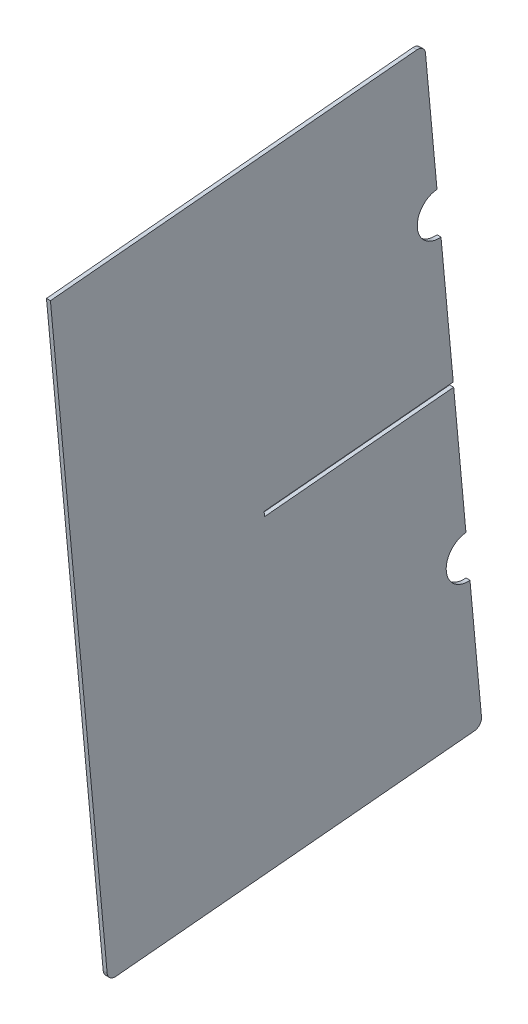
ISO-10303-21;
HEADER;
FILE_DESCRIPTION(('STEP AP214'),'2;1');
FILE_NAME('part.step','',(''),(''),'','','');
FILE_SCHEMA(('AUTOMOTIVE_DESIGN { 1 0 10303 214 1 1 1 1 }'));
ENDSEC;
DATA;
#1=APPLICATION_CONTEXT('core data for automotive mechanical design processes');
#2=APPLICATION_PROTOCOL_DEFINITION('international standard','automotive_design',2000,#1);
#3=PRODUCT_CONTEXT('',#1,'mechanical');
#4=PRODUCT('Part','Part','',(#3));
#5=PRODUCT_RELATED_PRODUCT_CATEGORY('part','',(#4));
#6=PRODUCT_DEFINITION_FORMATION('','',#4);
#7=PRODUCT_DEFINITION_CONTEXT('part definition',#1,'design');
#8=PRODUCT_DEFINITION('design','',#6,#7);
#9=PRODUCT_DEFINITION_SHAPE('','',#8);
#10=(LENGTH_UNIT() NAMED_UNIT(*) SI_UNIT(.MILLI.,.METRE.));
#11=(NAMED_UNIT(*) PLANE_ANGLE_UNIT() SI_UNIT($,.RADIAN.));
#12=(NAMED_UNIT(*) SI_UNIT($,.STERADIAN.) SOLID_ANGLE_UNIT());
#13=UNCERTAINTY_MEASURE_WITH_UNIT(LENGTH_MEASURE(1.E-05),#10,'distance_accuracy_value','');
#14=(GEOMETRIC_REPRESENTATION_CONTEXT(3) GLOBAL_UNCERTAINTY_ASSIGNED_CONTEXT((#13)) GLOBAL_UNIT_ASSIGNED_CONTEXT((#10,
#11,#12)) REPRESENTATION_CONTEXT('',''));
#15=CARTESIAN_POINT('',(0.,0.,0.));
#16=DIRECTION('',(0.,0.,1.));
#17=DIRECTION('',(1.,0.,0.));
#18=AXIS2_PLACEMENT_3D('',#15,#16,#17);
#19=CARTESIAN_POINT('',(-60.4999999998031,-99.708493786069,804.821228277155));
#20=DIRECTION('',(0.,-0.99571264607084,-0.092500413267217));
#21=DIRECTION('',(0.,0.092500413267217,-0.99571264607084));
#22=AXIS2_PLACEMENT_3D('',#19,#20,#21);
#23=PLANE('',#22);
#24=DIRECTION('',(0.,-0.092500413267217,0.99571264607084));
#25=VECTOR('',#24,1.);
#26=CARTESIAN_POINT('',(-61.4999999998031,-99.708493786069,804.821228277155));
#27=LINE('',#26,#25);
#28=CARTESIAN_POINT('',(-61.4999999998031,-99.8934946126034,806.812653569297));
#29=VERTEX_POINT('',#28);
#30=CARTESIAN_POINT('',(-61.4999999998031,-108.31103221992,897.422504361746));
#31=VERTEX_POINT('',#30);
#32=EDGE_CURVE('E156',#29,#31,#27,.T.);
#33=ORIENTED_EDGE('',*,*,#32,.F.);
#34=DIRECTION('',(-1.,0.,0.));
#35=VECTOR('',#34,1.);
#36=CARTESIAN_POINT('',(-60.4999999998031,-99.8934946126034,806.812653569297));
#37=LINE('',#36,#35);
#38=CARTESIAN_POINT('',(-60.4999999998031,-99.8934946126034,806.812653569297));
#39=VERTEX_POINT('',#38);
#40=EDGE_CURVE('E46',#29,#39,#37,.F.);
#41=ORIENTED_EDGE('',*,*,#40,.T.);
#42=DIRECTION('',(0.,-0.092500413267217,0.99571264607084));
#43=VECTOR('',#42,1.);
#44=CARTESIAN_POINT('',(-60.4999999998031,-99.708493786069,804.821228277155));
#45=LINE('',#44,#43);
#46=CARTESIAN_POINT('',(-60.4999999998032,-108.31103221992,897.422504361746));
#47=VERTEX_POINT('',#46);
#48=EDGE_CURVE('E164',#39,#47,#45,.T.);
#49=ORIENTED_EDGE('',*,*,#48,.T.);
#50=DIRECTION('',(1.,0.,0.));
#51=VECTOR('',#50,1.);
#52=CARTESIAN_POINT('',(-60.4999999998032,-108.31103221992,897.422504361746));
#53=LINE('',#52,#51);
#54=EDGE_CURVE('E257',#47,#31,#53,.F.);
#55=ORIENTED_EDGE('',*,*,#54,.T.);
#56=EDGE_LOOP('',(#33,#41,#49,#55));
#57=FACE_BOUND('',#56,.T.);
#58=ADVANCED_FACE('F38',(#57),#23,.T.);
#59=CARTESIAN_POINT('',(-60.4999999998029,-66.3521201426958,807.919992121607));
#60=DIRECTION('',(0.,0.0925004132672192,-0.99571264607084));
#61=DIRECTION('',(0.,0.99571264607084,0.0925004132672192));
#62=AXIS2_PLACEMENT_3D('',#59,#60,#61);
#63=PLANE('',#62);
#64=DIRECTION('',(0.,-0.99571264607084,-0.0925004132672192));
#65=VECTOR('',#64,1.);
#66=CARTESIAN_POINT('',(-60.4999999998029,-66.3521201426958,807.919992121607));
#67=LINE('',#66,#65);
#68=CARTESIAN_POINT('',(-60.4999999998029,-66.3521201426958,807.919992121607));
#69=VERTEX_POINT('',#68);
#70=CARTESIAN_POINT('',(-60.4999999998031,-97.7170684939274,805.00622910369));
#71=VERTEX_POINT('',#70);
#72=EDGE_CURVE('E198',#69,#71,#67,.T.);
#73=ORIENTED_EDGE('',*,*,#72,.T.);
#74=DIRECTION('',(-1.,0.,0.));
#75=VECTOR('',#74,1.);
#76=CARTESIAN_POINT('',(-60.4999999998031,-97.7170684939274,805.00622910369));
#77=LINE('',#76,#75);
#78=CARTESIAN_POINT('',(-61.4999999998031,-97.7170684939274,805.00622910369));
#79=VERTEX_POINT('',#78);
#80=EDGE_CURVE('E262',#71,#79,#77,.T.);
#81=ORIENTED_EDGE('',*,*,#80,.T.);
#82=DIRECTION('',(0.,-0.99571264607084,-0.0925004132672192));
#83=VECTOR('',#82,1.);
#84=CARTESIAN_POINT('',(-61.4999999998029,-66.3521201426958,807.919992121607));
#85=LINE('',#84,#83);
#86=CARTESIAN_POINT('',(-61.4999999998029,-66.3521201426958,807.919992121607));
#87=VERTEX_POINT('',#86);
#88=EDGE_CURVE('E232',#87,#79,#85,.T.);
#89=ORIENTED_EDGE('',*,*,#88,.F.);
#90=DIRECTION('',(-1.,0.,0.));
#91=VECTOR('',#90,1.);
#92=CARTESIAN_POINT('',(-60.4999999998029,-66.3521201426958,807.919992121607));
#93=LINE('',#92,#91);
#94=EDGE_CURVE('E235',#69,#87,#93,.T.);
#95=ORIENTED_EDGE('',*,*,#94,.F.);
#96=EDGE_LOOP('',(#73,#81,#89,#95));
#97=FACE_BOUND('',#96,.T.);
#98=ADVANCED_FACE('F268',(#97),#63,.T.);
#99=CARTESIAN_POINT('',(-60.4999999998029,-60.8757005893063,808.428744394577));
#100=DIRECTION('',(-1.,0.,0.));
#101=DIRECTION('',(0.,-1.,0.));
#102=AXIS2_PLACEMENT_3D('',#99,#100,#101);
#103=CYLINDRICAL_SURFACE('',#102,5.49999999999996);
#104=CARTESIAN_POINT('',(-61.4999999998029,-60.8757005893063,808.428744394577));
#105=DIRECTION('',(1.,0.,0.));
#106=DIRECTION('',(0.,1.,0.));
#107=AXIS2_PLACEMENT_3D('',#104,#105,#106);
#108=CIRCLE('',#107,5.49999999999996);
#109=CARTESIAN_POINT('',(-61.4999999998028,-55.3992810359167,808.937496667546));
#110=VERTEX_POINT('',#109);
#111=EDGE_CURVE('E229',#110,#87,#108,.T.);
#112=ORIENTED_EDGE('',*,*,#111,.F.);
#113=DIRECTION('',(-1.,0.,0.));
#114=VECTOR('',#113,1.);
#115=CARTESIAN_POINT('',(-60.4999999998029,-55.3992810359167,808.937496667546));
#116=LINE('',#115,#114);
#117=CARTESIAN_POINT('',(-60.4999999998029,-55.3992810359167,808.937496667546));
#118=VERTEX_POINT('',#117);
#119=EDGE_CURVE('E237',#118,#110,#116,.T.);
#120=ORIENTED_EDGE('',*,*,#119,.F.);
#121=CARTESIAN_POINT('',(-60.4999999998029,-60.8757005893063,808.428744394577));
#122=DIRECTION('',(1.,0.,0.));
#123=DIRECTION('',(0.,1.,0.));
#124=AXIS2_PLACEMENT_3D('',#121,#122,#123);
#125=CIRCLE('',#124,5.49999999999996);
#126=EDGE_CURVE('E195',#118,#69,#125,.T.);
#127=ORIENTED_EDGE('',*,*,#126,.T.);
#128=ORIENTED_EDGE('',*,*,#94,.T.);
#129=EDGE_LOOP('',(#112,#120,#127,#128));
#130=FACE_BOUND('',#129,.T.);
#131=ADVANCED_FACE('F276',(#130),#103,.F.);
#132=CARTESIAN_POINT('',(-60.4999999998027,-22.0429073925434,812.036260511998));
#133=DIRECTION('',(0.,0.092500413267219,-0.99571264607084));
#134=DIRECTION('',(0.,0.99571264607084,0.092500413267219));
#135=AXIS2_PLACEMENT_3D('',#132,#133,#134);
#136=PLANE('',#135);
#137=DIRECTION('',(0.,-0.99571264607084,-0.092500413267219));
#138=VECTOR('',#137,1.);
#139=CARTESIAN_POINT('',(-61.4999999998027,-22.0429073925434,812.036260511998));
#140=LINE('',#139,#138);
#141=CARTESIAN_POINT('',(-61.4999999998027,-22.0429073925434,812.036260511998));
#142=VERTEX_POINT('',#141);
#143=EDGE_CURVE('E226',#142,#110,#140,.T.);
#144=ORIENTED_EDGE('',*,*,#143,.F.);
#145=DIRECTION('',(-1.,0.,0.));
#146=VECTOR('',#145,1.);
#147=CARTESIAN_POINT('',(-60.4999999998027,-22.0429073925434,812.036260511998));
#148=LINE('',#147,#146);
#149=CARTESIAN_POINT('',(-60.4999999998027,-22.0429073925434,812.036260511998));
#150=VERTEX_POINT('',#149);
#151=EDGE_CURVE('E239',#150,#142,#148,.T.);
#152=ORIENTED_EDGE('',*,*,#151,.F.);
#153=DIRECTION('',(0.,-0.99571264607084,-0.092500413267219));
#154=VECTOR('',#153,1.);
#155=CARTESIAN_POINT('',(-60.4999999998027,-22.0429073925434,812.036260511998));
#156=LINE('',#155,#154);
#157=EDGE_CURVE('E192',#150,#118,#156,.T.);
#158=ORIENTED_EDGE('',*,*,#157,.T.);
#159=ORIENTED_EDGE('',*,*,#119,.T.);
#160=EDGE_LOOP('',(#144,#152,#158,#159));
#161=FACE_BOUND('',#160,.T.);
#162=ADVANCED_FACE('F296',(#161),#136,.T.);
#163=CARTESIAN_POINT('',(-60.4999999998027,-26.4829272293701,859.830467523402));
#164=DIRECTION('',(0.,0.99571264607084,0.0925004132672169));
#165=DIRECTION('',(0.,-0.0925004132672169,0.99571264607084));
#166=AXIS2_PLACEMENT_3D('',#163,#164,#165);
#167=PLANE('',#166);
#168=DIRECTION('',(0.,0.0925004132672169,-0.99571264607084));
#169=VECTOR('',#168,1.);
#170=CARTESIAN_POINT('',(-61.4999999998027,-26.4829272293701,859.830467523402));
#171=LINE('',#170,#169);
#172=CARTESIAN_POINT('',(-61.4999999998027,-26.4829272293701,859.830467523402));
#173=VERTEX_POINT('',#172);
#174=EDGE_CURVE('E223',#173,#142,#171,.T.);
#175=ORIENTED_EDGE('',*,*,#174,.F.);
#176=DIRECTION('',(-1.,0.,0.));
#177=VECTOR('',#176,1.);
#178=CARTESIAN_POINT('',(-60.4999999998027,-26.4829272293701,859.830467523402));
#179=LINE('',#178,#177);
#180=CARTESIAN_POINT('',(-60.4999999998027,-26.4829272293701,859.830467523402));
#181=VERTEX_POINT('',#180);
#182=EDGE_CURVE('E241',#181,#173,#179,.T.);
#183=ORIENTED_EDGE('',*,*,#182,.F.);
#184=DIRECTION('',(0.,0.0925004132672169,-0.99571264607084));
#185=VECTOR('',#184,1.);
#186=CARTESIAN_POINT('',(-60.4999999998027,-26.4829272293701,859.830467523402));
#187=LINE('',#186,#185);
#188=EDGE_CURVE('E189',#181,#150,#187,.T.);
#189=ORIENTED_EDGE('',*,*,#188,.T.);
#190=ORIENTED_EDGE('',*,*,#151,.T.);
#191=EDGE_LOOP('',(#175,#183,#189,#190));
#192=FACE_BOUND('',#191,.T.);
#193=ADVANCED_FACE('F299',(#192),#167,.T.);
#194=CARTESIAN_POINT('',(-60.4999999998027,-25.2880720540852,859.941468019322));
#195=DIRECTION('',(0.,0.0925004132671777,-0.995712646070844));
#196=DIRECTION('',(0.,0.995712646070844,0.0925004132671777));
#197=AXIS2_PLACEMENT_3D('',#194,#195,#196);
#198=PLANE('',#197);
#199=DIRECTION('',(0.,-0.995712646070844,-0.0925004132671777));
#200=VECTOR('',#199,1.);
#201=CARTESIAN_POINT('',(-61.4999999998027,-25.2880720540852,859.941468019322));
#202=LINE('',#201,#200);
#203=CARTESIAN_POINT('',(-61.4999999998027,-25.2880720540852,859.941468019322));
#204=VERTEX_POINT('',#203);
#205=EDGE_CURVE('E220',#204,#173,#202,.T.);
#206=ORIENTED_EDGE('',*,*,#205,.F.);
#207=DIRECTION('',(-1.,0.,0.));
#208=VECTOR('',#207,1.);
#209=CARTESIAN_POINT('',(-60.4999999998027,-25.2880720540852,859.941468019322));
#210=LINE('',#209,#208);
#211=CARTESIAN_POINT('',(-60.4999999998027,-25.2880720540852,859.941468019322));
#212=VERTEX_POINT('',#211);
#213=EDGE_CURVE('E243',#212,#204,#210,.T.);
#214=ORIENTED_EDGE('',*,*,#213,.F.);
#215=DIRECTION('',(0.,-0.995712646070844,-0.0925004132671777));
#216=VECTOR('',#215,1.);
#217=CARTESIAN_POINT('',(-60.4999999998027,-25.2880720540852,859.941468019322));
#218=LINE('',#217,#216);
#219=EDGE_CURVE('E186',#212,#181,#218,.T.);
#220=ORIENTED_EDGE('',*,*,#219,.T.);
#221=ORIENTED_EDGE('',*,*,#182,.T.);
#222=EDGE_LOOP('',(#206,#214,#220,#221));
#223=FACE_BOUND('',#222,.T.);
#224=ADVANCED_FACE('F303',(#223),#198,.T.);
#225=CARTESIAN_POINT('',(-60.4999999998027,-20.8480522172588,812.147261007922));
#226=DIRECTION('',(0.,-0.99571264607084,-0.0925004132672171));
#227=DIRECTION('',(0.,0.0925004132672171,-0.99571264607084));
#228=AXIS2_PLACEMENT_3D('',#225,#226,#227);
#229=PLANE('',#228);
#230=DIRECTION('',(0.,-0.0925004132672171,0.99571264607084));
#231=VECTOR('',#230,1.);
#232=CARTESIAN_POINT('',(-61.4999999998026,-20.8480522172587,812.147261007922));
#233=LINE('',#232,#231);
#234=CARTESIAN_POINT('',(-61.4999999998026,-20.8480522172587,812.147261007922));
#235=VERTEX_POINT('',#234);
#236=EDGE_CURVE('E217',#235,#204,#233,.T.);
#237=ORIENTED_EDGE('',*,*,#236,.F.);
#238=DIRECTION('',(-1.,0.,0.));
#239=VECTOR('',#238,1.);
#240=CARTESIAN_POINT('',(-60.4999999998027,-20.8480522172588,812.147261007922));
#241=LINE('',#240,#239);
#242=CARTESIAN_POINT('',(-60.4999999998027,-20.8480522172588,812.147261007922));
#243=VERTEX_POINT('',#242);
#244=EDGE_CURVE('E245',#243,#235,#241,.T.);
#245=ORIENTED_EDGE('',*,*,#244,.F.);
#246=DIRECTION('',(0.,-0.0925004132672171,0.99571264607084));
#247=VECTOR('',#246,1.);
#248=CARTESIAN_POINT('',(-60.4999999998027,-20.8480522172588,812.147261007922));
#249=LINE('',#248,#247);
#250=EDGE_CURVE('E183',#243,#212,#249,.T.);
#251=ORIENTED_EDGE('',*,*,#250,.T.);
#252=ORIENTED_EDGE('',*,*,#213,.T.);
#253=EDGE_LOOP('',(#237,#245,#251,#252));
#254=FACE_BOUND('',#253,.T.);
#255=ADVANCED_FACE('F307',(#254),#229,.T.);
#256=CARTESIAN_POINT('',(-60.4999999998025,12.4087501615073,815.236774811047));
#257=DIRECTION('',(0.,0.0925004132672173,-0.99571264607084));
#258=DIRECTION('',(0.,0.99571264607084,0.0925004132672173));
#259=AXIS2_PLACEMENT_3D('',#256,#257,#258);
#260=PLANE('',#259);
#261=DIRECTION('',(0.,-0.99571264607084,-0.0925004132672173));
#262=VECTOR('',#261,1.);
#263=CARTESIAN_POINT('',(-61.4999999998025,12.4087501615073,815.236774811047));
#264=LINE('',#263,#262);
#265=CARTESIAN_POINT('',(-61.4999999998025,12.4087501615073,815.236774811047));
#266=VERTEX_POINT('',#265);
#267=EDGE_CURVE('E214',#266,#235,#264,.T.);
#268=ORIENTED_EDGE('',*,*,#267,.F.);
#269=DIRECTION('',(-1.,0.,0.));
#270=VECTOR('',#269,1.);
#271=CARTESIAN_POINT('',(-60.4999999998025,12.4087501615073,815.236774811047));
#272=LINE('',#271,#270);
#273=CARTESIAN_POINT('',(-60.4999999998025,12.4087501615073,815.236774811047));
#274=VERTEX_POINT('',#273);
#275=EDGE_CURVE('E247',#274,#266,#272,.T.);
#276=ORIENTED_EDGE('',*,*,#275,.F.);
#277=DIRECTION('',(0.,-0.99571264607084,-0.0925004132672173));
#278=VECTOR('',#277,1.);
#279=CARTESIAN_POINT('',(-60.4999999998025,12.4087501615073,815.236774811047));
#280=LINE('',#279,#278);
#281=EDGE_CURVE('E180',#274,#243,#280,.T.);
#282=ORIENTED_EDGE('',*,*,#281,.T.);
#283=ORIENTED_EDGE('',*,*,#244,.T.);
#284=EDGE_LOOP('',(#268,#276,#282,#283));
#285=FACE_BOUND('',#284,.T.);
#286=ADVANCED_FACE('F311',(#285),#260,.T.);
#287=CARTESIAN_POINT('',(-60.4999999998025,17.8851697148972,815.745527084013));
#288=DIRECTION('',(-1.,0.,0.));
#289=DIRECTION('',(0.,-1.,0.));
#290=AXIS2_PLACEMENT_3D('',#287,#288,#289);
#291=CYLINDRICAL_SURFACE('',#290,5.49999999999998);
#292=CARTESIAN_POINT('',(-61.4999999998025,17.8851697148972,815.745527084013));
#293=DIRECTION('',(1.,0.,0.));
#294=DIRECTION('',(0.,1.,0.));
#295=AXIS2_PLACEMENT_3D('',#292,#293,#294);
#296=CIRCLE('',#295,5.49999999999998);
#297=CARTESIAN_POINT('',(-61.4999999998024,23.3615892682868,816.254279356983));
#298=VERTEX_POINT('',#297);
#299=EDGE_CURVE('E211',#298,#266,#296,.T.);
#300=ORIENTED_EDGE('',*,*,#299,.F.);
#301=DIRECTION('',(-1.,0.,0.));
#302=VECTOR('',#301,1.);
#303=CARTESIAN_POINT('',(-60.4999999998025,23.3615892682868,816.254279356983));
#304=LINE('',#303,#302);
#305=CARTESIAN_POINT('',(-60.4999999998025,23.3615892682868,816.254279356983));
#306=VERTEX_POINT('',#305);
#307=EDGE_CURVE('E249',#306,#298,#304,.T.);
#308=ORIENTED_EDGE('',*,*,#307,.F.);
#309=CARTESIAN_POINT('',(-60.4999999998025,17.8851697148972,815.745527084013));
#310=DIRECTION('',(1.,0.,0.));
#311=DIRECTION('',(0.,1.,0.));
#312=AXIS2_PLACEMENT_3D('',#309,#310,#311);
#313=CIRCLE('',#312,5.49999999999998);
#314=EDGE_CURVE('E177',#306,#274,#313,.T.);
#315=ORIENTED_EDGE('',*,*,#314,.T.);
#316=ORIENTED_EDGE('',*,*,#275,.T.);
#317=EDGE_LOOP('',(#300,#308,#315,#316));
#318=FACE_BOUND('',#317,.T.);
#319=ADVANCED_FACE('F315',(#318),#291,.F.);
#320=CARTESIAN_POINT('',(-60.4999999998023,54.6269663549112,819.158792333574));
#321=DIRECTION('',(0.,0.092500413267222,-0.99571264607084));
#322=DIRECTION('',(0.,0.99571264607084,0.092500413267222));
#323=AXIS2_PLACEMENT_3D('',#320,#321,#322);
#324=PLANE('',#323);
#325=DIRECTION('',(0.,-0.995712646070839,-0.092500413267222));
#326=VECTOR('',#325,1.);
#327=CARTESIAN_POINT('',(-61.4999999998023,54.6269663549112,819.158792333574));
#328=LINE('',#327,#326);
#329=CARTESIAN_POINT('',(-61.4999999998023,54.626966354911,819.158792333576));
#330=VERTEX_POINT('',#329);
#331=EDGE_CURVE('E208',#330,#298,#328,.T.);
#332=ORIENTED_EDGE('',*,*,#331,.F.);
#333=DIRECTION('',(-1.,0.,0.));
#334=VECTOR('',#333,1.);
#335=CARTESIAN_POINT('',(-60.4999999998023,54.626966354911,819.158792333576));
#336=LINE('',#335,#334);
#337=CARTESIAN_POINT('',(-60.4999999998023,54.626966354911,819.158792333576));
#338=VERTEX_POINT('',#337);
#339=EDGE_CURVE('E251',#338,#330,#336,.T.);
#340=ORIENTED_EDGE('',*,*,#339,.F.);
#341=DIRECTION('',(0.,-0.995712646070839,-0.092500413267222));
#342=VECTOR('',#341,1.);
#343=CARTESIAN_POINT('',(-60.4999999998023,54.6269663549112,819.158792333574));
#344=LINE('',#343,#342);
#345=EDGE_CURVE('E172',#338,#306,#344,.T.);
#346=ORIENTED_EDGE('',*,*,#345,.T.);
#347=ORIENTED_EDGE('',*,*,#307,.T.);
#348=EDGE_LOOP('',(#332,#340,#346,#347));
#349=FACE_BOUND('',#348,.T.);
#350=ADVANCED_FACE('F319',(#349),#324,.T.);
#351=CARTESIAN_POINT('',(-60.4999999998023,54.4419655283763,821.15021762572));
#352=DIRECTION('',(-1.,0.,0.));
#353=DIRECTION('',(0.,-1.,0.));
#354=AXIS2_PLACEMENT_3D('',#351,#352,#353);
#355=CYLINDRICAL_SURFACE('',#354,2.00000000000213);
#356=CARTESIAN_POINT('',(-61.4999999998023,54.4419655283763,821.15021762572));
#357=DIRECTION('',(-1.,0.,0.));
#358=DIRECTION('',(0.,-1.,0.));
#359=AXIS2_PLACEMENT_3D('',#356,#357,#358);
#360=CIRCLE('',#359,2.00000000000213);
#361=CARTESIAN_POINT('',(-61.4999999998023,56.4333908205182,821.33521845225));
#362=VERTEX_POINT('',#361);
#363=EDGE_CURVE('E205',#362,#330,#360,.T.);
#364=ORIENTED_EDGE('',*,*,#363,.F.);
#365=DIRECTION('',(-1.,0.,0.));
#366=VECTOR('',#365,1.);
#367=CARTESIAN_POINT('',(-60.4999999998023,56.4333908205182,821.33521845225));
#368=LINE('',#367,#366);
#369=CARTESIAN_POINT('',(-60.4999999998023,56.4333908205182,821.33521845225));
#370=VERTEX_POINT('',#369);
#371=EDGE_CURVE('E163',#370,#362,#368,.T.);
#372=ORIENTED_EDGE('',*,*,#371,.F.);
#373=CARTESIAN_POINT('',(-60.4999999998023,54.4419655283763,821.15021762572));
#374=DIRECTION('',(-1.,0.,0.));
#375=DIRECTION('',(0.,-1.,0.));
#376=AXIS2_PLACEMENT_3D('',#373,#374,#375);
#377=CIRCLE('',#376,2.00000000000213);
#378=EDGE_CURVE('E170',#370,#338,#377,.T.);
#379=ORIENTED_EDGE('',*,*,#378,.T.);
#380=ORIENTED_EDGE('',*,*,#339,.T.);
#381=EDGE_LOOP('',(#364,#372,#379,#380));
#382=FACE_BOUND('',#381,.T.);
#383=ADVANCED_FACE('F323',(#382),#355,.T.);
#384=CARTESIAN_POINT('',(-60.4999999998024,47.8308523866686,913.936494536838));
#385=DIRECTION('',(0.,0.995712646070842,0.0925004132671993));
#386=DIRECTION('',(0.,-0.0925004132671993,0.995712646070842));
#387=AXIS2_PLACEMENT_3D('',#384,#385,#386);
#388=PLANE('',#387);
#389=DIRECTION('',(0.,0.0925004132671993,-0.995712646070842));
#390=VECTOR('',#389,1.);
#391=CARTESIAN_POINT('',(-61.4999999998023,47.8308523866686,913.936494536838));
#392=LINE('',#391,#390);
#393=CARTESIAN_POINT('',(-61.4999999998023,47.8308523866686,913.936494536838));
#394=VERTEX_POINT('',#393);
#395=EDGE_CURVE('E162',#394,#362,#392,.T.);
#396=ORIENTED_EDGE('',*,*,#395,.F.);
#397=DIRECTION('',(-1.,0.,0.));
#398=VECTOR('',#397,1.);
#399=CARTESIAN_POINT('',(-60.4999999998024,47.8308523866686,913.936494536838));
#400=LINE('',#399,#398);
#401=CARTESIAN_POINT('',(-60.4999999998024,47.8308523866686,913.936494536838));
#402=VERTEX_POINT('',#401);
#403=EDGE_CURVE('E148',#402,#394,#400,.T.);
#404=ORIENTED_EDGE('',*,*,#403,.F.);
#405=DIRECTION('',(0.,0.0925004132671993,-0.995712646070842));
#406=VECTOR('',#405,1.);
#407=CARTESIAN_POINT('',(-60.4999999998024,47.8308523866686,913.936494536838));
#408=LINE('',#407,#406);
#409=EDGE_CURVE('E155',#402,#370,#408,.T.);
#410=ORIENTED_EDGE('',*,*,#409,.T.);
#411=ORIENTED_EDGE('',*,*,#371,.T.);
#412=EDGE_LOOP('',(#396,#404,#410,#411));
#413=FACE_BOUND('',#412,.T.);
#414=ADVANCED_FACE('F160',(#413),#388,.T.);
#415=CARTESIAN_POINT('',(-60.4999999998036,-187.15733208605,892.106397005779));
#416=DIRECTION('',(0.,-0.0925004132671993,0.995712646070842));
#417=DIRECTION('',(0.,-0.995712646070842,-0.0925004132671993));
#418=AXIS2_PLACEMENT_3D('',#415,#416,#417);
#419=PLANE('',#418);
#420=DIRECTION('',(0.,0.995712646070842,0.0925004132671993));
#421=VECTOR('',#420,1.);
#422=CARTESIAN_POINT('',(-61.4999999998035,-187.15733208605,892.106397005779));
#423=LINE('',#422,#421);
#424=CARTESIAN_POINT('',(-61.4999999998031,-106.504607754313,899.598930480422));
#425=VERTEX_POINT('',#424);
#426=EDGE_CURVE('E202',#425,#394,#423,.T.);
#427=ORIENTED_EDGE('',*,*,#426,.F.);
#428=DIRECTION('',(1.,0.,0.));
#429=VECTOR('',#428,1.);
#430=CARTESIAN_POINT('',(-60.4999999998032,-106.504607754313,899.598930480422));
#431=LINE('',#430,#429);
#432=CARTESIAN_POINT('',(-60.4999999998032,-106.504607754313,899.598930480422));
#433=VERTEX_POINT('',#432);
#434=EDGE_CURVE('E151',#425,#433,#431,.T.);
#435=ORIENTED_EDGE('',*,*,#434,.T.);
#436=DIRECTION('',(0.,0.995712646070842,0.0925004132671993));
#437=VECTOR('',#436,1.);
#438=CARTESIAN_POINT('',(-60.4999999998036,-187.15733208605,892.106397005779));
#439=LINE('',#438,#437);
#440=EDGE_CURVE('E144',#433,#402,#439,.T.);
#441=ORIENTED_EDGE('',*,*,#440,.T.);
#442=ORIENTED_EDGE('',*,*,#403,.T.);
#443=EDGE_LOOP('',(#427,#435,#441,#442));
#444=FACE_BOUND('',#443,.T.);
#445=ADVANCED_FACE('F147',(#444),#419,.T.);
#446=CARTESIAN_POINT('',(-60.4999999998033,-139.63657089351,801.11196170514));
#447=DIRECTION('',(1.,0.,0.));
#448=DIRECTION('',(0.,1.,0.));
#449=AXIS2_PLACEMENT_3D('',#446,#447,#448);
#450=PLANE('',#449);
#451=ORIENTED_EDGE('',*,*,#48,.F.);
#452=CARTESIAN_POINT('',(-60.4999999998031,-97.9020693204618,806.997654395831));
#453=DIRECTION('',(1.,0.,0.));
#454=DIRECTION('',(0.,1.,0.));
#455=AXIS2_PLACEMENT_3D('',#452,#453,#454);
#456=CIRCLE('',#455,2.);
#457=EDGE_CURVE('E11',#39,#71,#456,.T.);
#458=ORIENTED_EDGE('',*,*,#457,.T.);
#459=ORIENTED_EDGE('',*,*,#72,.F.);
#460=ORIENTED_EDGE('',*,*,#126,.F.);
#461=ORIENTED_EDGE('',*,*,#157,.F.);
#462=ORIENTED_EDGE('',*,*,#188,.F.);
#463=ORIENTED_EDGE('',*,*,#219,.F.);
#464=ORIENTED_EDGE('',*,*,#250,.F.);
#465=ORIENTED_EDGE('',*,*,#281,.F.);
#466=ORIENTED_EDGE('',*,*,#314,.F.);
#467=ORIENTED_EDGE('',*,*,#345,.F.);
#468=ORIENTED_EDGE('',*,*,#378,.F.);
#469=ORIENTED_EDGE('',*,*,#409,.F.);
#470=ORIENTED_EDGE('',*,*,#440,.F.);
#471=CARTESIAN_POINT('',(-60.4999999998032,-106.319606927779,897.607505188281));
#472=DIRECTION('',(1.,0.,0.));
#473=DIRECTION('',(0.,1.,0.));
#474=AXIS2_PLACEMENT_3D('',#471,#472,#473);
#475=CIRCLE('',#474,2.);
#476=EDGE_CURVE('E255',#433,#47,#475,.T.);
#477=ORIENTED_EDGE('',*,*,#476,.T.);
#478=EDGE_LOOP('',(#451,#458,#459,#460,#461,#462,#463,#464,#465,#466,#467,#468,#469,#470,#477));
#479=FACE_BOUND('',#478,.T.);
#480=ADVANCED_FACE('F167',(#479),#450,.T.);
#481=CARTESIAN_POINT('',(-61.4999999998033,-139.63657089351,801.11196170514));
#482=DIRECTION('',(1.,0.,0.));
#483=DIRECTION('',(0.,1.,0.));
#484=AXIS2_PLACEMENT_3D('',#481,#482,#483);
#485=PLANE('',#484);
#486=ORIENTED_EDGE('',*,*,#88,.T.);
#487=CARTESIAN_POINT('',(-61.499999999803,-97.9020693204618,806.997654395831));
#488=DIRECTION('',(1.,0.,0.));
#489=DIRECTION('',(0.,1.,0.));
#490=AXIS2_PLACEMENT_3D('',#487,#488,#489);
#491=CIRCLE('',#490,2.);
#492=EDGE_CURVE('E60',#79,#29,#491,.F.);
#493=ORIENTED_EDGE('',*,*,#492,.T.);
#494=ORIENTED_EDGE('',*,*,#32,.T.);
#495=CARTESIAN_POINT('',(-61.4999999998031,-106.319606927779,897.607505188281));
#496=DIRECTION('',(1.,0.,0.));
#497=DIRECTION('',(0.,1.,0.));
#498=AXIS2_PLACEMENT_3D('',#495,#496,#497);
#499=CIRCLE('',#498,2.);
#500=EDGE_CURVE('E260',#31,#425,#499,.F.);
#501=ORIENTED_EDGE('',*,*,#500,.T.);
#502=ORIENTED_EDGE('',*,*,#426,.T.);
#503=ORIENTED_EDGE('',*,*,#395,.T.);
#504=ORIENTED_EDGE('',*,*,#363,.T.);
#505=ORIENTED_EDGE('',*,*,#331,.T.);
#506=ORIENTED_EDGE('',*,*,#299,.T.);
#507=ORIENTED_EDGE('',*,*,#267,.T.);
#508=ORIENTED_EDGE('',*,*,#236,.T.);
#509=ORIENTED_EDGE('',*,*,#205,.T.);
#510=ORIENTED_EDGE('',*,*,#174,.T.);
#511=ORIENTED_EDGE('',*,*,#143,.T.);
#512=ORIENTED_EDGE('',*,*,#111,.T.);
#513=EDGE_LOOP('',(#486,#493,#494,#501,#502,#503,#504,#505,#506,#507,#508,#509,#510,#511,#512));
#514=FACE_BOUND('',#513,.T.);
#515=ADVANCED_FACE('F272',(#514),#485,.F.);
#516=CARTESIAN_POINT('',(-60.4999999998032,-106.319606927779,897.607505188281));
#517=DIRECTION('',(1.,0.,0.));
#518=DIRECTION('',(0.,1.,0.));
#519=AXIS2_PLACEMENT_3D('',#516,#517,#518);
#520=CYLINDRICAL_SURFACE('',#519,2.);
#521=ORIENTED_EDGE('',*,*,#500,.F.);
#522=ORIENTED_EDGE('',*,*,#54,.F.);
#523=ORIENTED_EDGE('',*,*,#476,.F.);
#524=ORIENTED_EDGE('',*,*,#434,.F.);
#525=EDGE_LOOP('',(#521,#522,#523,#524));
#526=FACE_BOUND('',#525,.T.);
#527=ADVANCED_FACE('F280',(#526),#520,.T.);
#528=CARTESIAN_POINT('',(-60.4999999998031,-97.9020693204618,806.997654395831));
#529=DIRECTION('',(-1.,0.,0.));
#530=DIRECTION('',(0.,-1.,0.));
#531=AXIS2_PLACEMENT_3D('',#528,#529,#530);
#532=CYLINDRICAL_SURFACE('',#531,2.);
#533=ORIENTED_EDGE('',*,*,#457,.F.);
#534=ORIENTED_EDGE('',*,*,#40,.F.);
#535=ORIENTED_EDGE('',*,*,#492,.F.);
#536=ORIENTED_EDGE('',*,*,#80,.F.);
#537=EDGE_LOOP('',(#533,#534,#535,#536));
#538=FACE_BOUND('',#537,.T.);
#539=ADVANCED_FACE('F40',(#538),#532,.T.);
#540=CLOSED_SHELL('',(#58,#98,#131,#162,#193,#224,#255,#286,#319,#350,#383,#414,#445,#480,#515,
#527,#539));
#541=MANIFOLD_SOLID_BREP('B2',#540);
#542=ADVANCED_BREP_SHAPE_REPRESENTATION('',(#18,#541),#14);
#543=SHAPE_DEFINITION_REPRESENTATION(#9,#542);
ENDSEC;
END-ISO-10303-21;
